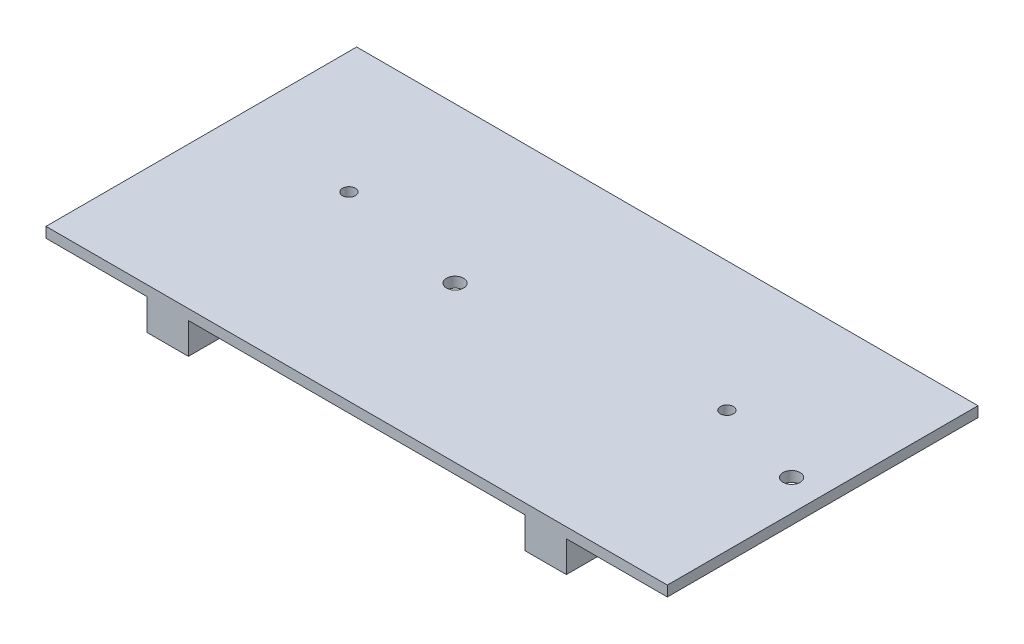
ISO-10303-21;
HEADER;
FILE_DESCRIPTION(('STEP AP214'),'2;1');
FILE_NAME('part.step','',(''),(''),'','','');
FILE_SCHEMA(('AUTOMOTIVE_DESIGN { 1 0 10303 214 1 1 1 1 }'));
ENDSEC;
DATA;
#1=APPLICATION_CONTEXT('core data for automotive mechanical design processes');
#2=APPLICATION_PROTOCOL_DEFINITION('international standard','automotive_design',2000,#1);
#3=PRODUCT_CONTEXT('',#1,'mechanical');
#4=PRODUCT('Part','Part','',(#3));
#5=PRODUCT_RELATED_PRODUCT_CATEGORY('part','',(#4));
#6=PRODUCT_DEFINITION_FORMATION('','',#4);
#7=PRODUCT_DEFINITION_CONTEXT('part definition',#1,'design');
#8=PRODUCT_DEFINITION('design','',#6,#7);
#9=PRODUCT_DEFINITION_SHAPE('','',#8);
#10=(LENGTH_UNIT() NAMED_UNIT(*) SI_UNIT(.MILLI.,.METRE.));
#11=(NAMED_UNIT(*) PLANE_ANGLE_UNIT() SI_UNIT($,.RADIAN.));
#12=(NAMED_UNIT(*) SI_UNIT($,.STERADIAN.) SOLID_ANGLE_UNIT());
#13=UNCERTAINTY_MEASURE_WITH_UNIT(LENGTH_MEASURE(1.E-05),#10,'distance_accuracy_value','');
#14=(GEOMETRIC_REPRESENTATION_CONTEXT(3) GLOBAL_UNCERTAINTY_ASSIGNED_CONTEXT((#13)) GLOBAL_UNIT_ASSIGNED_CONTEXT((#10,
#11,#12)) REPRESENTATION_CONTEXT('',''));
#15=CARTESIAN_POINT('',(0.,0.,0.));
#16=DIRECTION('',(0.,0.,1.));
#17=DIRECTION('',(1.,0.,0.));
#18=AXIS2_PLACEMENT_3D('',#15,#16,#17);
#19=CARTESIAN_POINT('',(0.,0.,0.));
#20=DIRECTION('',(0.,1.,0.));
#21=DIRECTION('',(0.,0.,1.));
#22=AXIS2_PLACEMENT_3D('',#19,#20,#21);
#23=PLANE('',#22);
#24=CARTESIAN_POINT('',(-11.,0.,0.));
#25=DIRECTION('',(0.,1.,0.));
#26=DIRECTION('',(0.,0.,1.));
#27=AXIS2_PLACEMENT_3D('',#24,#25,#26);
#28=CIRCLE('',#27,1.64999999999999);
#29=CARTESIAN_POINT('',(-11.,0.,1.64999999999999));
#30=VERTEX_POINT('',#29);
#31=EDGE_CURVE('E264',#30,#30,#28,.T.);
#32=ORIENTED_EDGE('',*,*,#31,.T.);
#33=EDGE_LOOP('',(#32));
#34=FACE_BOUND('',#33,.T.);
#35=DIRECTION('',(0.,0.,-1.));
#36=VECTOR('',#35,1.);
#37=CARTESIAN_POINT('',(32.5,0.,30.));
#38=LINE('',#37,#36);
#39=CARTESIAN_POINT('',(32.5,0.,30.));
#40=VERTEX_POINT('',#39);
#41=CARTESIAN_POINT('',(32.5,0.,-30.));
#42=VERTEX_POINT('',#41);
#43=EDGE_CURVE('E246',#40,#42,#38,.T.);
#44=ORIENTED_EDGE('',*,*,#43,.F.);
#45=DIRECTION('',(1.,0.,0.));
#46=VECTOR('',#45,1.);
#47=CARTESIAN_POINT('',(60.,0.,30.));
#48=LINE('',#47,#46);
#49=CARTESIAN_POINT('',(-32.5,0.,30.));
#50=VERTEX_POINT('',#49);
#51=EDGE_CURVE('E149',#50,#40,#48,.T.);
#52=ORIENTED_EDGE('',*,*,#51,.F.);
#53=DIRECTION('',(0.,0.,1.));
#54=VECTOR('',#53,1.);
#55=CARTESIAN_POINT('',(-32.5,0.,30.));
#56=LINE('',#55,#54);
#57=CARTESIAN_POINT('',(-32.5,0.,-30.));
#58=VERTEX_POINT('',#57);
#59=EDGE_CURVE('E151',#58,#50,#56,.T.);
#60=ORIENTED_EDGE('',*,*,#59,.F.);
#61=DIRECTION('',(-1.,0.,0.));
#62=VECTOR('',#61,1.);
#63=CARTESIAN_POINT('',(60.,0.,-30.));
#64=LINE('',#63,#62);
#65=EDGE_CURVE('E201',#42,#58,#64,.T.);
#66=ORIENTED_EDGE('',*,*,#65,.F.);
#67=EDGE_LOOP('',(#44,#52,#60,#66));
#68=FACE_BOUND('',#67,.T.);
#69=ADVANCED_FACE('F38',(#34,#68),#23,.F.);
#70=CARTESIAN_POINT('',(54.,0.,0.));
#71=DIRECTION('',(0.,1.,0.));
#72=DIRECTION('',(0.,0.,1.));
#73=AXIS2_PLACEMENT_3D('',#70,#71,#72);
#74=CIRCLE('',#73,1.65);
#75=CARTESIAN_POINT('',(54.,0.,1.64999999999999));
#76=VERTEX_POINT('',#75);
#77=EDGE_CURVE('E270',#76,#76,#74,.T.);
#78=ORIENTED_EDGE('',*,*,#77,.T.);
#79=EDGE_LOOP('',(#78));
#80=FACE_BOUND('',#79,.T.);
#81=DIRECTION('',(0.,0.,1.));
#82=VECTOR('',#81,1.);
#83=CARTESIAN_POINT('',(40.5,0.,30.));
#84=LINE('',#83,#82);
#85=CARTESIAN_POINT('',(40.5,0.,-30.));
#86=VERTEX_POINT('',#85);
#87=CARTESIAN_POINT('',(40.5,0.,30.));
#88=VERTEX_POINT('',#87);
#89=EDGE_CURVE('E144',#86,#88,#84,.T.);
#90=ORIENTED_EDGE('',*,*,#89,.F.);
#91=CARTESIAN_POINT('',(60.,0.,-30.));
#92=VERTEX_POINT('',#91);
#93=EDGE_CURVE('E184',#92,#86,#64,.T.);
#94=ORIENTED_EDGE('',*,*,#93,.F.);
#95=DIRECTION('',(0.,0.,-1.));
#96=VECTOR('',#95,1.);
#97=CARTESIAN_POINT('',(60.,0.,30.));
#98=LINE('',#97,#96);
#99=CARTESIAN_POINT('',(60.,0.,30.));
#100=VERTEX_POINT('',#99);
#101=EDGE_CURVE('E196',#100,#92,#98,.T.);
#102=ORIENTED_EDGE('',*,*,#101,.F.);
#103=EDGE_CURVE('E193',#88,#100,#48,.T.);
#104=ORIENTED_EDGE('',*,*,#103,.F.);
#105=EDGE_LOOP('',(#90,#94,#102,#104));
#106=FACE_BOUND('',#105,.T.);
#107=ADVANCED_FACE('F218',(#80,#106),#23,.F.);
#108=DIRECTION('',(0.,0.,-1.));
#109=VECTOR('',#108,1.);
#110=CARTESIAN_POINT('',(-40.5,0.,30.));
#111=LINE('',#110,#109);
#112=CARTESIAN_POINT('',(-40.5,0.,30.));
#113=VERTEX_POINT('',#112);
#114=CARTESIAN_POINT('',(-40.5,0.,-30.));
#115=VERTEX_POINT('',#114);
#116=EDGE_CURVE('E62',#113,#115,#111,.T.);
#117=ORIENTED_EDGE('',*,*,#116,.F.);
#118=CARTESIAN_POINT('',(-60.,0.,30.));
#119=VERTEX_POINT('',#118);
#120=EDGE_CURVE('E194',#119,#113,#48,.T.);
#121=ORIENTED_EDGE('',*,*,#120,.F.);
#122=DIRECTION('',(0.,0.,1.));
#123=VECTOR('',#122,1.);
#124=CARTESIAN_POINT('',(-60.,0.,30.));
#125=LINE('',#124,#123);
#126=CARTESIAN_POINT('',(-60.,0.,-30.));
#127=VERTEX_POINT('',#126);
#128=EDGE_CURVE('E179',#127,#119,#125,.T.);
#129=ORIENTED_EDGE('',*,*,#128,.F.);
#130=EDGE_CURVE('E198',#115,#127,#64,.T.);
#131=ORIENTED_EDGE('',*,*,#130,.F.);
#132=EDGE_LOOP('',(#117,#121,#129,#131));
#133=FACE_BOUND('',#132,.T.);
#134=ADVANCED_FACE('F230',(#133),#23,.F.);
#135=CARTESIAN_POINT('',(-60.,2.,30.));
#136=DIRECTION('',(1.,0.,0.));
#137=DIRECTION('',(0.,0.,-1.));
#138=AXIS2_PLACEMENT_3D('',#135,#136,#137);
#139=PLANE('',#138);
#140=ORIENTED_EDGE('',*,*,#128,.T.);
#141=DIRECTION('',(0.,-1.,0.));
#142=VECTOR('',#141,1.);
#143=CARTESIAN_POINT('',(-60.,2.,30.));
#144=LINE('',#143,#142);
#145=CARTESIAN_POINT('',(-60.,2.,30.));
#146=VERTEX_POINT('',#145);
#147=EDGE_CURVE('E11',#146,#119,#144,.T.);
#148=ORIENTED_EDGE('',*,*,#147,.F.);
#149=DIRECTION('',(0.,0.,1.));
#150=VECTOR('',#149,1.);
#151=CARTESIAN_POINT('',(-60.,2.,30.));
#152=LINE('',#151,#150);
#153=CARTESIAN_POINT('',(-60.,2.,-30.));
#154=VERTEX_POINT('',#153);
#155=EDGE_CURVE('E180',#154,#146,#152,.T.);
#156=ORIENTED_EDGE('',*,*,#155,.F.);
#157=DIRECTION('',(0.,-1.,0.));
#158=VECTOR('',#157,1.);
#159=CARTESIAN_POINT('',(-60.,2.,-30.));
#160=LINE('',#159,#158);
#161=EDGE_CURVE('E190',#154,#127,#160,.T.);
#162=ORIENTED_EDGE('',*,*,#161,.T.);
#163=EDGE_LOOP('',(#140,#148,#156,#162));
#164=FACE_BOUND('',#163,.T.);
#165=ADVANCED_FACE('F40',(#164),#139,.F.);
#166=CARTESIAN_POINT('',(60.,2.,30.));
#167=DIRECTION('',(0.,0.,-1.));
#168=DIRECTION('',(-1.,0.,0.));
#169=AXIS2_PLACEMENT_3D('',#166,#167,#168);
#170=PLANE('',#169);
#171=ORIENTED_EDGE('',*,*,#120,.T.);
#172=DIRECTION('',(0.,1.,0.));
#173=VECTOR('',#172,1.);
#174=CARTESIAN_POINT('',(-40.5,-6.,30.));
#175=LINE('',#174,#173);
#176=CARTESIAN_POINT('',(-40.5,-6.,30.));
#177=VERTEX_POINT('',#176);
#178=EDGE_CURVE('E165',#177,#113,#175,.T.);
#179=ORIENTED_EDGE('',*,*,#178,.F.);
#180=DIRECTION('',(-1.,0.,0.));
#181=VECTOR('',#180,1.);
#182=CARTESIAN_POINT('',(-40.5,-6.,30.));
#183=LINE('',#182,#181);
#184=CARTESIAN_POINT('',(-32.5,-6.,30.));
#185=VERTEX_POINT('',#184);
#186=EDGE_CURVE('E164',#185,#177,#183,.T.);
#187=ORIENTED_EDGE('',*,*,#186,.F.);
#188=DIRECTION('',(0.,1.,0.));
#189=VECTOR('',#188,1.);
#190=CARTESIAN_POINT('',(-32.5,-6.,30.));
#191=LINE('',#190,#189);
#192=EDGE_CURVE('E171',#185,#50,#191,.T.);
#193=ORIENTED_EDGE('',*,*,#192,.T.);
#194=ORIENTED_EDGE('',*,*,#51,.T.);
#195=DIRECTION('',(0.,1.,0.));
#196=VECTOR('',#195,1.);
#197=CARTESIAN_POINT('',(32.5,-6.,30.));
#198=LINE('',#197,#196);
#199=CARTESIAN_POINT('',(32.5,-6.,30.));
#200=VERTEX_POINT('',#199);
#201=EDGE_CURVE('E131',#200,#40,#198,.T.);
#202=ORIENTED_EDGE('',*,*,#201,.F.);
#203=DIRECTION('',(-1.,0.,0.));
#204=VECTOR('',#203,1.);
#205=CARTESIAN_POINT('',(40.5,-6.,30.));
#206=LINE('',#205,#204);
#207=CARTESIAN_POINT('',(40.5,-6.,30.));
#208=VERTEX_POINT('',#207);
#209=EDGE_CURVE('E135',#208,#200,#206,.T.);
#210=ORIENTED_EDGE('',*,*,#209,.F.);
#211=DIRECTION('',(0.,1.,0.));
#212=VECTOR('',#211,1.);
#213=CARTESIAN_POINT('',(40.5,-6.,30.));
#214=LINE('',#213,#212);
#215=EDGE_CURVE('E247',#208,#88,#214,.T.);
#216=ORIENTED_EDGE('',*,*,#215,.T.);
#217=ORIENTED_EDGE('',*,*,#103,.T.);
#218=DIRECTION('',(0.,-1.,0.));
#219=VECTOR('',#218,1.);
#220=CARTESIAN_POINT('',(60.,2.,30.));
#221=LINE('',#220,#219);
#222=CARTESIAN_POINT('',(60.,2.,30.));
#223=VERTEX_POINT('',#222);
#224=EDGE_CURVE('E47',#223,#100,#221,.T.);
#225=ORIENTED_EDGE('',*,*,#224,.F.);
#226=DIRECTION('',(1.,0.,0.));
#227=VECTOR('',#226,1.);
#228=CARTESIAN_POINT('',(60.,2.,30.));
#229=LINE('',#228,#227);
#230=EDGE_CURVE('E183',#146,#223,#229,.T.);
#231=ORIENTED_EDGE('',*,*,#230,.F.);
#232=ORIENTED_EDGE('',*,*,#147,.T.);
#233=EDGE_LOOP('',(#171,#179,#187,#193,#194,#202,#210,#216,#217,#225,#231,#232));
#234=FACE_BOUND('',#233,.T.);
#235=ADVANCED_FACE('F147',(#234),#170,.F.);
#236=CARTESIAN_POINT('',(60.,2.,30.));
#237=DIRECTION('',(-1.,0.,0.));
#238=DIRECTION('',(0.,0.,1.));
#239=AXIS2_PLACEMENT_3D('',#236,#237,#238);
#240=PLANE('',#239);
#241=ORIENTED_EDGE('',*,*,#101,.T.);
#242=DIRECTION('',(0.,-1.,0.));
#243=VECTOR('',#242,1.);
#244=CARTESIAN_POINT('',(60.,2.,-30.));
#245=LINE('',#244,#243);
#246=CARTESIAN_POINT('',(60.,2.,-30.));
#247=VERTEX_POINT('',#246);
#248=EDGE_CURVE('E204',#247,#92,#245,.T.);
#249=ORIENTED_EDGE('',*,*,#248,.F.);
#250=DIRECTION('',(0.,0.,-1.));
#251=VECTOR('',#250,1.);
#252=CARTESIAN_POINT('',(60.,2.,30.));
#253=LINE('',#252,#251);
#254=EDGE_CURVE('E186',#223,#247,#253,.T.);
#255=ORIENTED_EDGE('',*,*,#254,.F.);
#256=ORIENTED_EDGE('',*,*,#224,.T.);
#257=EDGE_LOOP('',(#241,#249,#255,#256));
#258=FACE_BOUND('',#257,.T.);
#259=ADVANCED_FACE('F212',(#258),#240,.F.);
#260=CARTESIAN_POINT('',(60.,2.,-30.));
#261=DIRECTION('',(0.,0.,1.));
#262=DIRECTION('',(1.,0.,0.));
#263=AXIS2_PLACEMENT_3D('',#260,#261,#262);
#264=PLANE('',#263);
#265=ORIENTED_EDGE('',*,*,#93,.T.);
#266=DIRECTION('',(0.,1.,0.));
#267=VECTOR('',#266,1.);
#268=CARTESIAN_POINT('',(40.5,-6.,-30.));
#269=LINE('',#268,#267);
#270=CARTESIAN_POINT('',(40.5,-6.,-30.));
#271=VERTEX_POINT('',#270);
#272=EDGE_CURVE('E153',#271,#86,#269,.T.);
#273=ORIENTED_EDGE('',*,*,#272,.F.);
#274=DIRECTION('',(1.,0.,0.));
#275=VECTOR('',#274,1.);
#276=CARTESIAN_POINT('',(40.5,-6.,-30.));
#277=LINE('',#276,#275);
#278=CARTESIAN_POINT('',(32.5,-6.,-30.));
#279=VERTEX_POINT('',#278);
#280=EDGE_CURVE('E134',#279,#271,#277,.T.);
#281=ORIENTED_EDGE('',*,*,#280,.F.);
#282=DIRECTION('',(0.,1.,0.));
#283=VECTOR('',#282,1.);
#284=CARTESIAN_POINT('',(32.5,-6.,-30.));
#285=LINE('',#284,#283);
#286=EDGE_CURVE('E54',#279,#42,#285,.T.);
#287=ORIENTED_EDGE('',*,*,#286,.T.);
#288=ORIENTED_EDGE('',*,*,#65,.T.);
#289=DIRECTION('',(0.,1.,0.));
#290=VECTOR('',#289,1.);
#291=CARTESIAN_POINT('',(-32.5,-6.,-30.));
#292=LINE('',#291,#290);
#293=CARTESIAN_POINT('',(-32.5,-6.,-30.));
#294=VERTEX_POINT('',#293);
#295=EDGE_CURVE('E173',#294,#58,#292,.T.);
#296=ORIENTED_EDGE('',*,*,#295,.F.);
#297=DIRECTION('',(1.,0.,0.));
#298=VECTOR('',#297,1.);
#299=CARTESIAN_POINT('',(-40.5,-6.,-30.));
#300=LINE('',#299,#298);
#301=CARTESIAN_POINT('',(-40.5,-6.,-30.));
#302=VERTEX_POINT('',#301);
#303=EDGE_CURVE('E160',#302,#294,#300,.T.);
#304=ORIENTED_EDGE('',*,*,#303,.F.);
#305=DIRECTION('',(0.,1.,0.));
#306=VECTOR('',#305,1.);
#307=CARTESIAN_POINT('',(-40.5,-6.,-30.));
#308=LINE('',#307,#306);
#309=EDGE_CURVE('E176',#302,#115,#308,.T.);
#310=ORIENTED_EDGE('',*,*,#309,.T.);
#311=ORIENTED_EDGE('',*,*,#130,.T.);
#312=ORIENTED_EDGE('',*,*,#161,.F.);
#313=DIRECTION('',(-1.,0.,0.));
#314=VECTOR('',#313,1.);
#315=CARTESIAN_POINT('',(60.,2.,-30.));
#316=LINE('',#315,#314);
#317=EDGE_CURVE('E188',#247,#154,#316,.T.);
#318=ORIENTED_EDGE('',*,*,#317,.F.);
#319=ORIENTED_EDGE('',*,*,#248,.T.);
#320=EDGE_LOOP('',(#265,#273,#281,#287,#288,#296,#304,#310,#311,#312,#318,#319));
#321=FACE_BOUND('',#320,.T.);
#322=ADVANCED_FACE('F220',(#321),#264,.F.);
#323=CARTESIAN_POINT('',(0.,2.,0.));
#324=DIRECTION('',(0.,1.,0.));
#325=DIRECTION('',(0.,0.,1.));
#326=AXIS2_PLACEMENT_3D('',#323,#324,#325);
#327=PLANE('',#326);
#328=CARTESIAN_POINT('',(54.,2.,0.));
#329=DIRECTION('',(0.,1.,0.));
#330=DIRECTION('',(0.,0.,1.));
#331=AXIS2_PLACEMENT_3D('',#328,#329,#330);
#332=CIRCLE('',#331,1.64999999999999);
#333=CARTESIAN_POINT('',(54.,2.,1.64999999999998));
#334=VERTEX_POINT('',#333);
#335=EDGE_CURVE('E273',#334,#334,#332,.T.);
#336=ORIENTED_EDGE('',*,*,#335,.F.);
#337=EDGE_LOOP('',(#336));
#338=FACE_BOUND('',#337,.T.);
#339=CARTESIAN_POINT('',(-11.,2.,0.));
#340=DIRECTION('',(0.,1.,0.));
#341=DIRECTION('',(0.,0.,1.));
#342=AXIS2_PLACEMENT_3D('',#339,#340,#341);
#343=CIRCLE('',#342,1.64999999999999);
#344=CARTESIAN_POINT('',(-11.,2.,1.64999999999998));
#345=VERTEX_POINT('',#344);
#346=EDGE_CURVE('E267',#345,#345,#343,.T.);
#347=ORIENTED_EDGE('',*,*,#346,.F.);
#348=EDGE_LOOP('',(#347));
#349=FACE_BOUND('',#348,.T.);
#350=CARTESIAN_POINT('',(-36.5,2.,-5.));
#351=DIRECTION('',(0.,1.,0.));
#352=DIRECTION('',(0.,0.,1.));
#353=AXIS2_PLACEMENT_3D('',#350,#351,#352);
#354=CIRCLE('',#353,1.24999999999999);
#355=CARTESIAN_POINT('',(-36.5,2.,-3.75000000000001));
#356=VERTEX_POINT('',#355);
#357=EDGE_CURVE('E42',#356,#356,#354,.T.);
#358=ORIENTED_EDGE('',*,*,#357,.F.);
#359=EDGE_LOOP('',(#358));
#360=FACE_BOUND('',#359,.T.);
#361=CARTESIAN_POINT('',(36.5,2.,-4.99999999999999));
#362=DIRECTION('',(0.,1.,0.));
#363=DIRECTION('',(0.,0.,1.));
#364=AXIS2_PLACEMENT_3D('',#361,#362,#363);
#365=CIRCLE('',#364,1.24999999999999);
#366=CARTESIAN_POINT('',(36.5,2.,-3.75));
#367=VERTEX_POINT('',#366);
#368=EDGE_CURVE('E253',#367,#367,#365,.T.);
#369=ORIENTED_EDGE('',*,*,#368,.F.);
#370=EDGE_LOOP('',(#369));
#371=FACE_BOUND('',#370,.T.);
#372=ORIENTED_EDGE('',*,*,#155,.T.);
#373=ORIENTED_EDGE('',*,*,#230,.T.);
#374=ORIENTED_EDGE('',*,*,#254,.T.);
#375=ORIENTED_EDGE('',*,*,#317,.T.);
#376=EDGE_LOOP('',(#372,#373,#374,#375));
#377=FACE_BOUND('',#376,.T.);
#378=ADVANCED_FACE('F225',(#338,#349,#360,#371,#377),#327,.T.);
#379=CARTESIAN_POINT('',(-40.5,-6.,30.));
#380=DIRECTION('',(1.,0.,0.));
#381=DIRECTION('',(0.,0.,-1.));
#382=AXIS2_PLACEMENT_3D('',#379,#380,#381);
#383=PLANE('',#382);
#384=ORIENTED_EDGE('',*,*,#116,.T.);
#385=ORIENTED_EDGE('',*,*,#309,.F.);
#386=DIRECTION('',(0.,0.,-1.));
#387=VECTOR('',#386,1.);
#388=CARTESIAN_POINT('',(-40.5,-6.,30.));
#389=LINE('',#388,#387);
#390=EDGE_CURVE('E157',#177,#302,#389,.T.);
#391=ORIENTED_EDGE('',*,*,#390,.F.);
#392=ORIENTED_EDGE('',*,*,#178,.T.);
#393=EDGE_LOOP('',(#384,#385,#391,#392));
#394=FACE_BOUND('',#393,.T.);
#395=ADVANCED_FACE('F235',(#394),#383,.F.);
#396=CARTESIAN_POINT('',(-32.5,-6.,30.));
#397=DIRECTION('',(-1.,0.,0.));
#398=DIRECTION('',(0.,0.,1.));
#399=AXIS2_PLACEMENT_3D('',#396,#397,#398);
#400=PLANE('',#399);
#401=ORIENTED_EDGE('',*,*,#59,.T.);
#402=ORIENTED_EDGE('',*,*,#192,.F.);
#403=DIRECTION('',(0.,0.,1.));
#404=VECTOR('',#403,1.);
#405=CARTESIAN_POINT('',(-32.5,-6.,30.));
#406=LINE('',#405,#404);
#407=EDGE_CURVE('E162',#294,#185,#406,.T.);
#408=ORIENTED_EDGE('',*,*,#407,.F.);
#409=ORIENTED_EDGE('',*,*,#295,.T.);
#410=EDGE_LOOP('',(#401,#402,#408,#409));
#411=FACE_BOUND('',#410,.T.);
#412=ADVANCED_FACE('F242',(#411),#400,.F.);
#413=CARTESIAN_POINT('',(0.,-6.,0.));
#414=DIRECTION('',(0.,-1.,0.));
#415=DIRECTION('',(0.,0.,-1.));
#416=AXIS2_PLACEMENT_3D('',#413,#414,#415);
#417=PLANE('',#416);
#418=CARTESIAN_POINT('',(-36.5,-6.,-5.));
#419=DIRECTION('',(0.,-1.,0.));
#420=DIRECTION('',(0.,0.,-1.));
#421=AXIS2_PLACEMENT_3D('',#418,#419,#420);
#422=CIRCLE('',#421,1.24999999999999);
#423=CARTESIAN_POINT('',(-36.5,-6.,-6.24999999999999));
#424=VERTEX_POINT('',#423);
#425=EDGE_CURVE('E261',#424,#424,#422,.T.);
#426=ORIENTED_EDGE('',*,*,#425,.F.);
#427=EDGE_LOOP('',(#426));
#428=FACE_BOUND('',#427,.T.);
#429=ORIENTED_EDGE('',*,*,#390,.T.);
#430=ORIENTED_EDGE('',*,*,#303,.T.);
#431=ORIENTED_EDGE('',*,*,#407,.T.);
#432=ORIENTED_EDGE('',*,*,#186,.T.);
#433=EDGE_LOOP('',(#429,#430,#431,#432));
#434=FACE_BOUND('',#433,.T.);
#435=ADVANCED_FACE('F239',(#428,#434),#417,.T.);
#436=CARTESIAN_POINT('',(32.5,-6.,30.));
#437=DIRECTION('',(1.,0.,0.));
#438=DIRECTION('',(0.,0.,-1.));
#439=AXIS2_PLACEMENT_3D('',#436,#437,#438);
#440=PLANE('',#439);
#441=ORIENTED_EDGE('',*,*,#43,.T.);
#442=ORIENTED_EDGE('',*,*,#286,.F.);
#443=DIRECTION('',(0.,0.,-1.));
#444=VECTOR('',#443,1.);
#445=CARTESIAN_POINT('',(32.5,-6.,30.));
#446=LINE('',#445,#444);
#447=EDGE_CURVE('E127',#200,#279,#446,.T.);
#448=ORIENTED_EDGE('',*,*,#447,.F.);
#449=ORIENTED_EDGE('',*,*,#201,.T.);
#450=EDGE_LOOP('',(#441,#442,#448,#449));
#451=FACE_BOUND('',#450,.T.);
#452=ADVANCED_FACE('F129',(#451),#440,.F.);
#453=CARTESIAN_POINT('',(40.5,-6.,30.));
#454=DIRECTION('',(-1.,0.,0.));
#455=DIRECTION('',(0.,0.,1.));
#456=AXIS2_PLACEMENT_3D('',#453,#454,#455);
#457=PLANE('',#456);
#458=ORIENTED_EDGE('',*,*,#89,.T.);
#459=ORIENTED_EDGE('',*,*,#215,.F.);
#460=DIRECTION('',(0.,0.,1.));
#461=VECTOR('',#460,1.);
#462=CARTESIAN_POINT('',(40.5,-6.,30.));
#463=LINE('',#462,#461);
#464=EDGE_CURVE('E140',#271,#208,#463,.T.);
#465=ORIENTED_EDGE('',*,*,#464,.F.);
#466=ORIENTED_EDGE('',*,*,#272,.T.);
#467=EDGE_LOOP('',(#458,#459,#465,#466));
#468=FACE_BOUND('',#467,.T.);
#469=ADVANCED_FACE('F298',(#468),#457,.F.);
#470=CARTESIAN_POINT('',(0.,-6.,0.));
#471=DIRECTION('',(0.,-1.,0.));
#472=DIRECTION('',(0.,0.,-1.));
#473=AXIS2_PLACEMENT_3D('',#470,#471,#472);
#474=PLANE('',#473);
#475=CARTESIAN_POINT('',(36.5,-6.,-4.99999999999999));
#476=DIRECTION('',(0.,-1.,0.));
#477=DIRECTION('',(0.,0.,-1.));
#478=AXIS2_PLACEMENT_3D('',#475,#476,#477);
#479=CIRCLE('',#478,1.24999999999999);
#480=CARTESIAN_POINT('',(36.5,-6.,-6.24999999999998));
#481=VERTEX_POINT('',#480);
#482=EDGE_CURVE('E258',#481,#481,#479,.T.);
#483=ORIENTED_EDGE('',*,*,#482,.F.);
#484=EDGE_LOOP('',(#483));
#485=FACE_BOUND('',#484,.T.);
#486=ORIENTED_EDGE('',*,*,#209,.T.);
#487=ORIENTED_EDGE('',*,*,#447,.T.);
#488=ORIENTED_EDGE('',*,*,#280,.T.);
#489=ORIENTED_EDGE('',*,*,#464,.T.);
#490=EDGE_LOOP('',(#486,#487,#488,#489));
#491=FACE_BOUND('',#490,.T.);
#492=ADVANCED_FACE('F138',(#485,#491),#474,.T.);
#493=CARTESIAN_POINT('',(36.5,-6.,-4.99999999999999));
#494=DIRECTION('',(0.,-1.,0.));
#495=DIRECTION('',(0.,0.,-1.));
#496=AXIS2_PLACEMENT_3D('',#493,#494,#495);
#497=CYLINDRICAL_SURFACE('',#496,1.24999999999999);
#498=ORIENTED_EDGE('',*,*,#368,.T.);
#499=EDGE_LOOP('',(#498));
#500=FACE_BOUND('',#499,.T.);
#501=ORIENTED_EDGE('',*,*,#482,.T.);
#502=EDGE_LOOP('',(#501));
#503=FACE_BOUND('',#502,.T.);
#504=ADVANCED_FACE('F290',(#500,#503),#497,.F.);
#505=CARTESIAN_POINT('',(-36.5,-6.,-5.));
#506=DIRECTION('',(0.,-1.,0.));
#507=DIRECTION('',(0.,0.,-1.));
#508=AXIS2_PLACEMENT_3D('',#505,#506,#507);
#509=CYLINDRICAL_SURFACE('',#508,1.24999999999999);
#510=ORIENTED_EDGE('',*,*,#357,.T.);
#511=EDGE_LOOP('',(#510));
#512=FACE_BOUND('',#511,.T.);
#513=ORIENTED_EDGE('',*,*,#425,.T.);
#514=EDGE_LOOP('',(#513));
#515=FACE_BOUND('',#514,.T.);
#516=ADVANCED_FACE('F293',(#512,#515),#509,.F.);
#517=CARTESIAN_POINT('',(-11.,2.,0.));
#518=DIRECTION('',(0.,1.,0.));
#519=DIRECTION('',(0.,0.,1.));
#520=AXIS2_PLACEMENT_3D('',#517,#518,#519);
#521=CYLINDRICAL_SURFACE('',#520,1.64999999999999);
#522=ORIENTED_EDGE('',*,*,#346,.T.);
#523=EDGE_LOOP('',(#522));
#524=FACE_BOUND('',#523,.T.);
#525=ORIENTED_EDGE('',*,*,#31,.F.);
#526=EDGE_LOOP('',(#525));
#527=FACE_BOUND('',#526,.T.);
#528=ADVANCED_FACE('F385',(#524,#527),#521,.F.);
#529=CARTESIAN_POINT('',(54.,2.,0.));
#530=DIRECTION('',(0.,1.,0.));
#531=DIRECTION('',(0.,0.,1.));
#532=AXIS2_PLACEMENT_3D('',#529,#530,#531);
#533=CYLINDRICAL_SURFACE('',#532,1.65);
#534=ORIENTED_EDGE('',*,*,#335,.T.);
#535=EDGE_LOOP('',(#534));
#536=FACE_BOUND('',#535,.T.);
#537=ORIENTED_EDGE('',*,*,#77,.F.);
#538=EDGE_LOOP('',(#537));
#539=FACE_BOUND('',#538,.T.);
#540=ADVANCED_FACE('F277',(#536,#539),#533,.F.);
#541=CLOSED_SHELL('',(#69,#107,#134,#165,#235,#259,#322,#378,#395,#412,#435,#452,#469,#492,#504,
#516,#528,#540));
#542=MANIFOLD_SOLID_BREP('B2',#541);
#543=ADVANCED_BREP_SHAPE_REPRESENTATION('',(#18,#542),#14);
#544=SHAPE_DEFINITION_REPRESENTATION(#9,#543);
ENDSEC;
END-ISO-10303-21;
